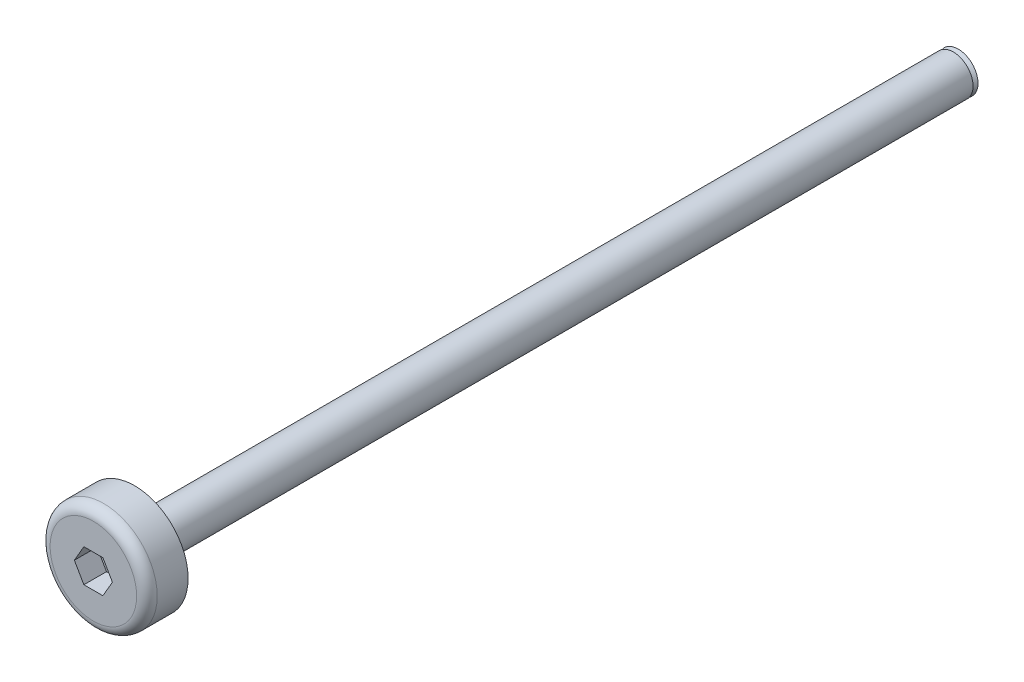
ISO-10303-21;
HEADER;
FILE_DESCRIPTION(('STEP AP214'),'2;1');
FILE_NAME('part.step','',(''),(''),'','','');
FILE_SCHEMA(('AUTOMOTIVE_DESIGN { 1 0 10303 214 1 1 1 1 }'));
ENDSEC;
DATA;
#1=APPLICATION_CONTEXT('core data for automotive mechanical design processes');
#2=APPLICATION_PROTOCOL_DEFINITION('international standard','automotive_design',2000,#1);
#3=PRODUCT_CONTEXT('',#1,'mechanical');
#4=PRODUCT('Part','Part','',(#3));
#5=PRODUCT_RELATED_PRODUCT_CATEGORY('part','',(#4));
#6=PRODUCT_DEFINITION_FORMATION('','',#4);
#7=PRODUCT_DEFINITION_CONTEXT('part definition',#1,'design');
#8=PRODUCT_DEFINITION('design','',#6,#7);
#9=PRODUCT_DEFINITION_SHAPE('','',#8);
#10=(LENGTH_UNIT() NAMED_UNIT(*) SI_UNIT(.MILLI.,.METRE.));
#11=(NAMED_UNIT(*) PLANE_ANGLE_UNIT() SI_UNIT($,.RADIAN.));
#12=(NAMED_UNIT(*) SI_UNIT($,.STERADIAN.) SOLID_ANGLE_UNIT());
#13=UNCERTAINTY_MEASURE_WITH_UNIT(LENGTH_MEASURE(1.E-05),#10,'distance_accuracy_value','');
#14=(GEOMETRIC_REPRESENTATION_CONTEXT(3) GLOBAL_UNCERTAINTY_ASSIGNED_CONTEXT((#13)) GLOBAL_UNIT_ASSIGNED_CONTEXT((#10,
#11,#12)) REPRESENTATION_CONTEXT('',''));
#15=CARTESIAN_POINT('',(0.,0.,0.));
#16=DIRECTION('',(0.,0.,1.));
#17=DIRECTION('',(1.,0.,0.));
#18=AXIS2_PLACEMENT_3D('',#15,#16,#17);
#19=CARTESIAN_POINT('',(0.,0.,2.5));
#20=DIRECTION('',(0.,0.,1.));
#21=DIRECTION('',(1.,0.,0.));
#22=AXIS2_PLACEMENT_3D('',#19,#20,#21);
#23=PLANE('',#22);
#24=CARTESIAN_POINT('',(0.,0.,2.5));
#25=DIRECTION('',(0.,0.,1.));
#26=DIRECTION('',(1.,0.,0.));
#27=AXIS2_PLACEMENT_3D('',#24,#25,#26);
#28=CIRCLE('',#27,2.625);
#29=CARTESIAN_POINT('',(2.625,0.,2.5));
#30=VERTEX_POINT('',#29);
#31=EDGE_CURVE('E142',#30,#30,#28,.T.);
#32=ORIENTED_EDGE('',*,*,#31,.T.);
#33=EDGE_LOOP('',(#32));
#34=FACE_BOUND('',#33,.T.);
#35=DIRECTION('',(0.5,-0.866025403784439,0.));
#36=VECTOR('',#35,1.);
#37=CARTESIAN_POINT('',(0.866025403784439,0.5,2.5));
#38=LINE('',#37,#36);
#39=CARTESIAN_POINT('',(0.577350269189626,1.,2.5));
#40=VERTEX_POINT('',#39);
#41=CARTESIAN_POINT('',(1.15470053837925,0.,2.5));
#42=VERTEX_POINT('',#41);
#43=EDGE_CURVE('E51',#40,#42,#38,.T.);
#44=ORIENTED_EDGE('',*,*,#43,.T.);
#45=DIRECTION('',(-0.5,-0.866025403784439,0.));
#46=VECTOR('',#45,1.);
#47=CARTESIAN_POINT('',(0.866025403784439,-0.5,2.5));
#48=LINE('',#47,#46);
#49=CARTESIAN_POINT('',(0.577350269189626,-1.,2.5));
#50=VERTEX_POINT('',#49);
#51=EDGE_CURVE('E11',#42,#50,#48,.T.);
#52=ORIENTED_EDGE('',*,*,#51,.T.);
#53=DIRECTION('',(-1.,0.,0.));
#54=VECTOR('',#53,1.);
#55=CARTESIAN_POINT('',(0.,-1.,2.5));
#56=LINE('',#55,#54);
#57=CARTESIAN_POINT('',(-0.577350269189626,-1.,2.5));
#58=VERTEX_POINT('',#57);
#59=EDGE_CURVE('E148',#50,#58,#56,.T.);
#60=ORIENTED_EDGE('',*,*,#59,.T.);
#61=DIRECTION('',(-0.5,0.866025403784439,0.));
#62=VECTOR('',#61,1.);
#63=CARTESIAN_POINT('',(-0.866025403784439,-0.5,2.5));
#64=LINE('',#63,#62);
#65=CARTESIAN_POINT('',(-1.15470053837925,0.,2.5));
#66=VERTEX_POINT('',#65);
#67=EDGE_CURVE('E151',#58,#66,#64,.T.);
#68=ORIENTED_EDGE('',*,*,#67,.T.);
#69=DIRECTION('',(0.5,0.866025403784439,0.));
#70=VECTOR('',#69,1.);
#71=CARTESIAN_POINT('',(-0.866025403784438,0.5,2.5));
#72=LINE('',#71,#70);
#73=CARTESIAN_POINT('',(-0.577350269189625,0.999999999999999,2.5));
#74=VERTEX_POINT('',#73);
#75=EDGE_CURVE('E154',#66,#74,#72,.T.);
#76=ORIENTED_EDGE('',*,*,#75,.T.);
#77=DIRECTION('',(1.,0.,0.));
#78=VECTOR('',#77,1.);
#79=CARTESIAN_POINT('',(0.,1.,2.5));
#80=LINE('',#79,#78);
#81=EDGE_CURVE('E157',#74,#40,#80,.T.);
#82=ORIENTED_EDGE('',*,*,#81,.T.);
#83=EDGE_LOOP('',(#44,#52,#60,#68,#76,#82));
#84=FACE_BOUND('',#83,.T.);
#85=ADVANCED_FACE('F43',(#34,#84),#23,.T.);
#86=CARTESIAN_POINT('',(0.,0.,2.5));
#87=DIRECTION('',(0.,0.,-1.));
#88=DIRECTION('',(-1.,0.,0.));
#89=AXIS2_PLACEMENT_3D('',#86,#87,#88);
#90=CYLINDRICAL_SURFACE('',#89,3.25);
#91=CARTESIAN_POINT('',(0.,0.,1.875));
#92=DIRECTION('',(0.,0.,1.));
#93=DIRECTION('',(1.,0.,0.));
#94=AXIS2_PLACEMENT_3D('',#91,#92,#93);
#95=CIRCLE('',#94,3.25);
#96=CARTESIAN_POINT('',(3.25,0.,1.875));
#97=VERTEX_POINT('',#96);
#98=EDGE_CURVE('E145',#97,#97,#95,.F.);
#99=ORIENTED_EDGE('',*,*,#98,.T.);
#100=EDGE_LOOP('',(#99));
#101=FACE_BOUND('',#100,.T.);
#102=CARTESIAN_POINT('',(0.,0.,0.));
#103=DIRECTION('',(0.,0.,1.));
#104=DIRECTION('',(1.,0.,0.));
#105=AXIS2_PLACEMENT_3D('',#102,#103,#104);
#106=CIRCLE('',#105,3.25);
#107=CARTESIAN_POINT('',(3.25,0.,0.));
#108=VERTEX_POINT('',#107);
#109=EDGE_CURVE('E100',#108,#108,#106,.T.);
#110=ORIENTED_EDGE('',*,*,#109,.T.);
#111=EDGE_LOOP('',(#110));
#112=FACE_BOUND('',#111,.T.);
#113=ADVANCED_FACE('F181',(#101,#112),#90,.T.);
#114=CARTESIAN_POINT('',(0.,0.,0.));
#115=DIRECTION('',(0.,0.,1.));
#116=DIRECTION('',(1.,0.,0.));
#117=AXIS2_PLACEMENT_3D('',#114,#115,#116);
#118=PLANE('',#117);
#119=CARTESIAN_POINT('',(0.,0.,0.));
#120=DIRECTION('',(0.,0.,1.));
#121=DIRECTION('',(1.,0.,0.));
#122=AXIS2_PLACEMENT_3D('',#119,#120,#121);
#123=CIRCLE('',#122,1.2);
#124=CARTESIAN_POINT('',(1.2,0.,0.));
#125=VERTEX_POINT('',#124);
#126=EDGE_CURVE('E119',#125,#125,#123,.T.);
#127=ORIENTED_EDGE('',*,*,#126,.T.);
#128=EDGE_LOOP('',(#127));
#129=FACE_BOUND('',#128,.T.);
#130=ORIENTED_EDGE('',*,*,#109,.F.);
#131=EDGE_LOOP('',(#130));
#132=FACE_BOUND('',#131,.T.);
#133=ADVANCED_FACE('F187',(#129,#132),#118,.F.);
#134=CARTESIAN_POINT('',(0.,0.,1.875));
#135=DIRECTION('',(0.,0.,1.));
#136=DIRECTION('',(1.,0.,0.));
#137=AXIS2_PLACEMENT_3D('',#134,#135,#136);
#138=TOROIDAL_SURFACE('',#137,2.625,0.625);
#139=ORIENTED_EDGE('',*,*,#98,.F.);
#140=EDGE_LOOP('',(#139));
#141=FACE_BOUND('',#140,.T.);
#142=ORIENTED_EDGE('',*,*,#31,.F.);
#143=EDGE_LOOP('',(#142));
#144=FACE_BOUND('',#143,.T.);
#145=ADVANCED_FACE('F45',(#141,#144),#138,.T.);
#146=CARTESIAN_POINT('',(0.577350269189626,-1.,2.51));
#147=DIRECTION('',(-0.866025403784439,0.5,0.));
#148=DIRECTION('',(-0.5,-0.866025403784439,0.));
#149=AXIS2_PLACEMENT_3D('',#146,#147,#148);
#150=PLANE('',#149);
#151=DIRECTION('',(0.,0.,-1.));
#152=VECTOR('',#151,1.);
#153=CARTESIAN_POINT('',(1.15470053837925,0.,2.51));
#154=LINE('',#153,#152);
#155=CARTESIAN_POINT('',(1.15470053837925,0.,1.125));
#156=VERTEX_POINT('',#155);
#157=EDGE_CURVE('E93',#42,#156,#154,.T.);
#158=ORIENTED_EDGE('',*,*,#157,.T.);
#159=DIRECTION('',(0.5,0.866025403784439,0.));
#160=VECTOR('',#159,1.);
#161=CARTESIAN_POINT('',(0.577350269189626,-1.,1.125));
#162=LINE('',#161,#160);
#163=CARTESIAN_POINT('',(0.577350269189626,-1.,1.125));
#164=VERTEX_POINT('',#163);
#165=EDGE_CURVE('E97',#164,#156,#162,.T.);
#166=ORIENTED_EDGE('',*,*,#165,.F.);
#167=DIRECTION('',(0.,0.,-1.));
#168=VECTOR('',#167,1.);
#169=CARTESIAN_POINT('',(0.577350269189626,-1.,2.51));
#170=LINE('',#169,#168);
#171=EDGE_CURVE('E132',#50,#164,#170,.T.);
#172=ORIENTED_EDGE('',*,*,#171,.F.);
#173=ORIENTED_EDGE('',*,*,#51,.F.);
#174=EDGE_LOOP('',(#158,#166,#172,#173));
#175=FACE_BOUND('',#174,.T.);
#176=ADVANCED_FACE('F95',(#175),#150,.T.);
#177=CARTESIAN_POINT('',(1.15470053837925,0.,2.51));
#178=DIRECTION('',(-0.866025403784439,-0.5,0.));
#179=DIRECTION('',(0.,0.,1.));
#180=AXIS2_PLACEMENT_3D('',#177,#178,#179);
#181=PLANE('',#180);
#182=DIRECTION('',(0.,0.,-1.));
#183=VECTOR('',#182,1.);
#184=CARTESIAN_POINT('',(0.577350269189626,1.,2.51));
#185=LINE('',#184,#183);
#186=CARTESIAN_POINT('',(0.577350269189626,1.,1.125));
#187=VERTEX_POINT('',#186);
#188=EDGE_CURVE('E101',#40,#187,#185,.T.);
#189=ORIENTED_EDGE('',*,*,#188,.T.);
#190=DIRECTION('',(-0.5,0.866025403784439,0.));
#191=VECTOR('',#190,1.);
#192=CARTESIAN_POINT('',(1.15470053837925,0.,1.125));
#193=LINE('',#192,#191);
#194=EDGE_CURVE('E104',#156,#187,#193,.T.);
#195=ORIENTED_EDGE('',*,*,#194,.F.);
#196=ORIENTED_EDGE('',*,*,#157,.F.);
#197=ORIENTED_EDGE('',*,*,#43,.F.);
#198=EDGE_LOOP('',(#189,#195,#196,#197));
#199=FACE_BOUND('',#198,.T.);
#200=ADVANCED_FACE('F105',(#199),#181,.T.);
#201=CARTESIAN_POINT('',(0.577350269189626,1.,2.51));
#202=DIRECTION('',(0.,-1.,0.));
#203=DIRECTION('',(1.,0.,0.));
#204=AXIS2_PLACEMENT_3D('',#201,#202,#203);
#205=PLANE('',#204);
#206=DIRECTION('',(0.,0.,-1.));
#207=VECTOR('',#206,1.);
#208=CARTESIAN_POINT('',(-0.577350269189625,0.999999999999999,2.51));
#209=LINE('',#208,#207);
#210=CARTESIAN_POINT('',(-0.577350269189625,0.999999999999999,1.125));
#211=VERTEX_POINT('',#210);
#212=EDGE_CURVE('E137',#74,#211,#209,.T.);
#213=ORIENTED_EDGE('',*,*,#212,.T.);
#214=DIRECTION('',(-1.,0.,0.));
#215=VECTOR('',#214,1.);
#216=CARTESIAN_POINT('',(0.577350269189626,1.,1.125));
#217=LINE('',#216,#215);
#218=EDGE_CURVE('E110',#187,#211,#217,.T.);
#219=ORIENTED_EDGE('',*,*,#218,.F.);
#220=ORIENTED_EDGE('',*,*,#188,.F.);
#221=ORIENTED_EDGE('',*,*,#81,.F.);
#222=EDGE_LOOP('',(#213,#219,#220,#221));
#223=FACE_BOUND('',#222,.T.);
#224=ADVANCED_FACE('F161',(#223),#205,.T.);
#225=CARTESIAN_POINT('',(-0.577350269189625,0.999999999999999,2.51));
#226=DIRECTION('',(0.866025403784439,-0.5,0.));
#227=DIRECTION('',(0.5,0.866025403784439,0.));
#228=AXIS2_PLACEMENT_3D('',#225,#226,#227);
#229=PLANE('',#228);
#230=DIRECTION('',(0.,0.,-1.));
#231=VECTOR('',#230,1.);
#232=CARTESIAN_POINT('',(-1.15470053837925,0.,2.51));
#233=LINE('',#232,#231);
#234=CARTESIAN_POINT('',(-1.15470053837925,0.,1.125));
#235=VERTEX_POINT('',#234);
#236=EDGE_CURVE('E135',#66,#235,#233,.T.);
#237=ORIENTED_EDGE('',*,*,#236,.T.);
#238=DIRECTION('',(-0.5,-0.866025403784439,0.));
#239=VECTOR('',#238,1.);
#240=CARTESIAN_POINT('',(-0.577350269189625,0.999999999999999,1.125));
#241=LINE('',#240,#239);
#242=EDGE_CURVE('E126',#211,#235,#241,.T.);
#243=ORIENTED_EDGE('',*,*,#242,.F.);
#244=ORIENTED_EDGE('',*,*,#212,.F.);
#245=ORIENTED_EDGE('',*,*,#75,.F.);
#246=EDGE_LOOP('',(#237,#243,#244,#245));
#247=FACE_BOUND('',#246,.T.);
#248=ADVANCED_FACE('F166',(#247),#229,.T.);
#249=CARTESIAN_POINT('',(-1.15470053837925,0.,2.51));
#250=DIRECTION('',(0.866025403784439,0.5,0.));
#251=DIRECTION('',(-0.5,0.866025403784439,0.));
#252=AXIS2_PLACEMENT_3D('',#249,#250,#251);
#253=PLANE('',#252);
#254=DIRECTION('',(0.,0.,-1.));
#255=VECTOR('',#254,1.);
#256=CARTESIAN_POINT('',(-0.577350269189626,-1.,2.51));
#257=LINE('',#256,#255);
#258=CARTESIAN_POINT('',(-0.577350269189626,-1.,1.125));
#259=VERTEX_POINT('',#258);
#260=EDGE_CURVE('E58',#58,#259,#257,.T.);
#261=ORIENTED_EDGE('',*,*,#260,.T.);
#262=DIRECTION('',(0.5,-0.866025403784439,0.));
#263=VECTOR('',#262,1.);
#264=CARTESIAN_POINT('',(-1.15470053837925,0.,1.125));
#265=LINE('',#264,#263);
#266=EDGE_CURVE('E129',#235,#259,#265,.T.);
#267=ORIENTED_EDGE('',*,*,#266,.F.);
#268=ORIENTED_EDGE('',*,*,#236,.F.);
#269=ORIENTED_EDGE('',*,*,#67,.F.);
#270=EDGE_LOOP('',(#261,#267,#268,#269));
#271=FACE_BOUND('',#270,.T.);
#272=ADVANCED_FACE('F169',(#271),#253,.T.);
#273=CARTESIAN_POINT('',(-0.577350269189626,-1.,2.51));
#274=DIRECTION('',(0.,1.,0.));
#275=DIRECTION('',(-1.,0.,0.));
#276=AXIS2_PLACEMENT_3D('',#273,#274,#275);
#277=PLANE('',#276);
#278=ORIENTED_EDGE('',*,*,#171,.T.);
#279=DIRECTION('',(1.,0.,0.));
#280=VECTOR('',#279,1.);
#281=CARTESIAN_POINT('',(-0.577350269189626,-1.,1.125));
#282=LINE('',#281,#280);
#283=EDGE_CURVE('E115',#259,#164,#282,.T.);
#284=ORIENTED_EDGE('',*,*,#283,.F.);
#285=ORIENTED_EDGE('',*,*,#260,.F.);
#286=ORIENTED_EDGE('',*,*,#59,.F.);
#287=EDGE_LOOP('',(#278,#284,#285,#286));
#288=FACE_BOUND('',#287,.T.);
#289=ADVANCED_FACE('F170',(#288),#277,.T.);
#290=CARTESIAN_POINT('',(1.15470053837925,0.,1.125));
#291=DIRECTION('',(0.,0.,1.));
#292=DIRECTION('',(-0.5,0.866025403784439,0.));
#293=AXIS2_PLACEMENT_3D('',#290,#291,#292);
#294=PLANE('',#293);
#295=ORIENTED_EDGE('',*,*,#165,.T.);
#296=ORIENTED_EDGE('',*,*,#194,.T.);
#297=ORIENTED_EDGE('',*,*,#218,.T.);
#298=ORIENTED_EDGE('',*,*,#242,.T.);
#299=ORIENTED_EDGE('',*,*,#266,.T.);
#300=ORIENTED_EDGE('',*,*,#283,.T.);
#301=EDGE_LOOP('',(#295,#296,#297,#298,#299,#300));
#302=FACE_BOUND('',#301,.T.);
#303=ADVANCED_FACE('F113',(#302),#294,.T.);
#304=CARTESIAN_POINT('',(0.,0.,0.));
#305=DIRECTION('',(0.,0.,-1.));
#306=DIRECTION('',(-1.,0.,0.));
#307=AXIS2_PLACEMENT_3D('',#304,#305,#306);
#308=CYLINDRICAL_SURFACE('',#307,1.2);
#309=ORIENTED_EDGE('',*,*,#126,.F.);
#310=EDGE_LOOP('',(#309));
#311=FACE_BOUND('',#310,.T.);
#312=CARTESIAN_POINT('',(0.,0.,-49.7));
#313=DIRECTION('',(0.,0.,1.));
#314=DIRECTION('',(1.,0.,0.));
#315=AXIS2_PLACEMENT_3D('',#312,#313,#314);
#316=CIRCLE('',#315,1.2);
#317=CARTESIAN_POINT('',(1.2,0.,-49.7));
#318=VERTEX_POINT('',#317);
#319=EDGE_CURVE('E122',#318,#318,#316,.T.);
#320=ORIENTED_EDGE('',*,*,#319,.T.);
#321=EDGE_LOOP('',(#320));
#322=FACE_BOUND('',#321,.T.);
#323=ADVANCED_FACE('F177',(#311,#322),#308,.T.);
#324=CARTESIAN_POINT('',(0.,0.,-49.7));
#325=DIRECTION('',(0.,0.,1.));
#326=DIRECTION('',(1.,0.,0.));
#327=AXIS2_PLACEMENT_3D('',#324,#325,#326);
#328=PLANE('',#327);
#329=CARTESIAN_POINT('',(0.,0.,-49.7));
#330=DIRECTION('',(0.,0.,-1.));
#331=DIRECTION('',(0.,1.,0.));
#332=AXIS2_PLACEMENT_3D('',#329,#330,#331);
#333=CIRCLE('',#332,0.9);
#334=CARTESIAN_POINT('',(0.,0.9,-49.7));
#335=VERTEX_POINT('',#334);
#336=EDGE_CURVE('E116',#335,#335,#333,.T.);
#337=ORIENTED_EDGE('',*,*,#336,.F.);
#338=EDGE_LOOP('',(#337));
#339=FACE_BOUND('',#338,.T.);
#340=ORIENTED_EDGE('',*,*,#319,.F.);
#341=EDGE_LOOP('',(#340));
#342=FACE_BOUND('',#341,.T.);
#343=ADVANCED_FACE('F219',(#339,#342),#328,.F.);
#344=CARTESIAN_POINT('',(0.,0.,-50.));
#345=DIRECTION('',(0.,0.,-1.));
#346=DIRECTION('',(0.,1.,0.));
#347=AXIS2_PLACEMENT_3D('',#344,#345,#346);
#348=PLANE('',#347);
#349=CARTESIAN_POINT('',(0.,0.,-50.));
#350=DIRECTION('',(0.,0.,-1.));
#351=DIRECTION('',(0.,1.,0.));
#352=AXIS2_PLACEMENT_3D('',#349,#350,#351);
#353=CIRCLE('',#352,1.2);
#354=CARTESIAN_POINT('',(0.,1.2,-50.));
#355=VERTEX_POINT('',#354);
#356=EDGE_CURVE('E205',#355,#355,#353,.T.);
#357=ORIENTED_EDGE('',*,*,#356,.T.);
#358=EDGE_LOOP('',(#357));
#359=FACE_BOUND('',#358,.T.);
#360=ADVANCED_FACE('F210',(#359),#348,.T.);
#361=CARTESIAN_POINT('',(0.,0.,-50.));
#362=DIRECTION('',(0.,0.,-1.));
#363=DIRECTION('',(0.,1.,0.));
#364=AXIS2_PLACEMENT_3D('',#361,#362,#363);
#365=CONICAL_SURFACE('',#364,1.2,0.785398163397457);
#366=ORIENTED_EDGE('',*,*,#336,.T.);
#367=EDGE_LOOP('',(#366));
#368=FACE_BOUND('',#367,.T.);
#369=ORIENTED_EDGE('',*,*,#356,.F.);
#370=EDGE_LOOP('',(#369));
#371=FACE_BOUND('',#370,.T.);
#372=ADVANCED_FACE('F212',(#368,#371),#365,.T.);
#373=CLOSED_SHELL('',(#85,#113,#133,#145,#176,#200,#224,#248,#272,#289,#303,#323,#343,#360,#372));
#374=MANIFOLD_SOLID_BREP('B2',#373);
#375=ADVANCED_BREP_SHAPE_REPRESENTATION('',(#18,#374),#14);
#376=SHAPE_DEFINITION_REPRESENTATION(#9,#375);
ENDSEC;
END-ISO-10303-21;
